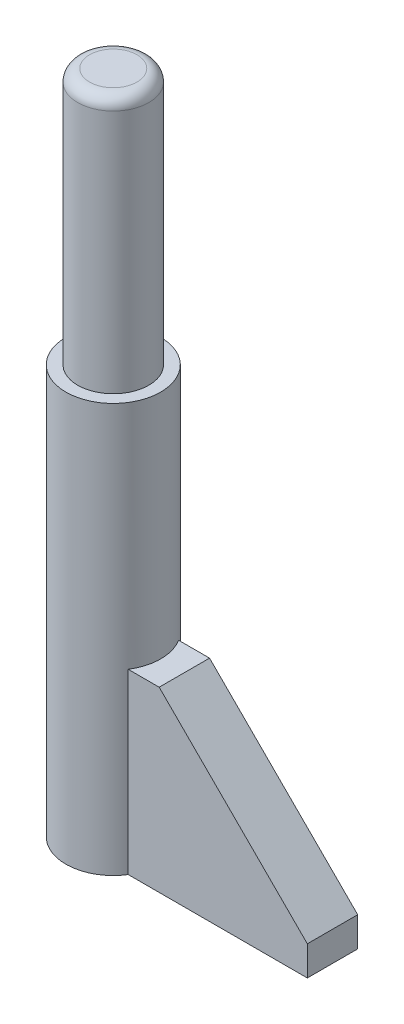
ISO-10303-21;
HEADER;
FILE_DESCRIPTION(('STEP AP214'),'2;1');
FILE_NAME('part.step','',(''),(''),'','','');
FILE_SCHEMA(('AUTOMOTIVE_DESIGN { 1 0 10303 214 1 1 1 1 }'));
ENDSEC;
DATA;
#1=APPLICATION_CONTEXT('core data for automotive mechanical design processes');
#2=APPLICATION_PROTOCOL_DEFINITION('international standard','automotive_design',2000,#1);
#3=PRODUCT_CONTEXT('',#1,'mechanical');
#4=PRODUCT('Part','Part','',(#3));
#5=PRODUCT_RELATED_PRODUCT_CATEGORY('part','',(#4));
#6=PRODUCT_DEFINITION_FORMATION('','',#4);
#7=PRODUCT_DEFINITION_CONTEXT('part definition',#1,'design');
#8=PRODUCT_DEFINITION('design','',#6,#7);
#9=PRODUCT_DEFINITION_SHAPE('','',#8);
#10=(LENGTH_UNIT() NAMED_UNIT(*) SI_UNIT(.MILLI.,.METRE.));
#11=(NAMED_UNIT(*) PLANE_ANGLE_UNIT() SI_UNIT($,.RADIAN.));
#12=(NAMED_UNIT(*) SI_UNIT($,.STERADIAN.) SOLID_ANGLE_UNIT());
#13=UNCERTAINTY_MEASURE_WITH_UNIT(LENGTH_MEASURE(1.E-05),#10,'distance_accuracy_value','');
#14=(GEOMETRIC_REPRESENTATION_CONTEXT(3) GLOBAL_UNCERTAINTY_ASSIGNED_CONTEXT((#13)) GLOBAL_UNIT_ASSIGNED_CONTEXT((#10,
#11,#12)) REPRESENTATION_CONTEXT('',''));
#15=CARTESIAN_POINT('',(0.,0.,0.));
#16=DIRECTION('',(0.,0.,1.));
#17=DIRECTION('',(1.,0.,0.));
#18=AXIS2_PLACEMENT_3D('',#15,#16,#17);
#19=CARTESIAN_POINT('',(0.,17.526,0.));
#20=DIRECTION('',(0.,-1.,0.));
#21=DIRECTION('',(0.,0.,-1.));
#22=AXIS2_PLACEMENT_3D('',#19,#20,#21);
#23=CYLINDRICAL_SURFACE('',#22,2.032);
#24=CARTESIAN_POINT('',(0.,0.,0.));
#25=DIRECTION('',(0.,1.,0.));
#26=DIRECTION('',(0.,0.,1.));
#27=AXIS2_PLACEMENT_3D('',#24,#25,#26);
#28=CIRCLE('',#27,2.032);
#29=CARTESIAN_POINT('',(1.7215410973892,0.,-1.0795));
#30=VERTEX_POINT('',#29);
#31=CARTESIAN_POINT('',(1.7215410973892,0.,1.0795));
#32=VERTEX_POINT('',#31);
#33=EDGE_CURVE('E101',#30,#32,#28,.T.);
#34=ORIENTED_EDGE('',*,*,#33,.T.);
#35=DIRECTION('',(0.,-1.,0.));
#36=VECTOR('',#35,1.);
#37=CARTESIAN_POINT('',(1.7215410973892,17.526,1.0795));
#38=LINE('',#37,#36);
#39=CARTESIAN_POINT('',(1.7215410973892,7.62,1.0795));
#40=VERTEX_POINT('',#39);
#41=EDGE_CURVE('E115',#32,#40,#38,.F.);
#42=ORIENTED_EDGE('',*,*,#41,.T.);
#43=CARTESIAN_POINT('',(0.,7.62,0.));
#44=DIRECTION('',(0.,-1.,0.));
#45=DIRECTION('',(0.,0.,-1.));
#46=AXIS2_PLACEMENT_3D('',#43,#44,#45);
#47=CIRCLE('',#46,2.032);
#48=CARTESIAN_POINT('',(1.7215410973892,7.62,-1.0795));
#49=VERTEX_POINT('',#48);
#50=EDGE_CURVE('E121',#49,#40,#47,.T.);
#51=ORIENTED_EDGE('',*,*,#50,.F.);
#52=DIRECTION('',(0.,-1.,0.));
#53=VECTOR('',#52,1.);
#54=CARTESIAN_POINT('',(1.7215410973892,17.526,-1.0795));
#55=LINE('',#54,#53);
#56=EDGE_CURVE('E112',#49,#30,#55,.T.);
#57=ORIENTED_EDGE('',*,*,#56,.T.);
#58=EDGE_LOOP('',(#34,#42,#51,#57));
#59=FACE_BOUND('',#58,.T.);
#60=CARTESIAN_POINT('',(0.,17.526,0.));
#61=DIRECTION('',(0.,1.,0.));
#62=DIRECTION('',(0.,0.,1.));
#63=AXIS2_PLACEMENT_3D('',#60,#61,#62);
#64=CIRCLE('',#63,2.032);
#65=CARTESIAN_POINT('',(0.,17.526,2.032));
#66=VERTEX_POINT('',#65);
#67=EDGE_CURVE('E118',#66,#66,#64,.T.);
#68=ORIENTED_EDGE('',*,*,#67,.F.);
#69=EDGE_LOOP('',(#68));
#70=FACE_BOUND('',#69,.T.);
#71=ADVANCED_FACE('F33',(#59,#70),#23,.T.);
#72=CARTESIAN_POINT('',(0.,17.526,0.));
#73=DIRECTION('',(0.,1.,0.));
#74=DIRECTION('',(0.,0.,1.));
#75=AXIS2_PLACEMENT_3D('',#72,#73,#74);
#76=PLANE('',#75);
#77=CARTESIAN_POINT('',(0.,17.526,0.));
#78=DIRECTION('',(0.,1.,0.));
#79=DIRECTION('',(0.,0.,1.));
#80=AXIS2_PLACEMENT_3D('',#77,#78,#79);
#81=CIRCLE('',#80,1.524);
#82=CARTESIAN_POINT('',(0.,17.526,1.524));
#83=VERTEX_POINT('',#82);
#84=EDGE_CURVE('E103',#83,#83,#81,.T.);
#85=ORIENTED_EDGE('',*,*,#84,.F.);
#86=EDGE_LOOP('',(#85));
#87=FACE_BOUND('',#86,.T.);
#88=ORIENTED_EDGE('',*,*,#67,.T.);
#89=EDGE_LOOP('',(#88));
#90=FACE_BOUND('',#89,.T.);
#91=ADVANCED_FACE('F143',(#87,#90),#76,.T.);
#92=CARTESIAN_POINT('',(0.,0.,0.));
#93=DIRECTION('',(0.,1.,0.));
#94=DIRECTION('',(0.,0.,1.));
#95=AXIS2_PLACEMENT_3D('',#92,#93,#94);
#96=PLANE('',#95);
#97=ORIENTED_EDGE('',*,*,#33,.F.);
#98=DIRECTION('',(1.,0.,0.));
#99=VECTOR('',#98,1.);
#100=CARTESIAN_POINT('',(9.398,0.,-1.0795));
#101=LINE('',#100,#99);
#102=CARTESIAN_POINT('',(9.398,0.,-1.0795));
#103=VERTEX_POINT('',#102);
#104=EDGE_CURVE('E85',#30,#103,#101,.T.);
#105=ORIENTED_EDGE('',*,*,#104,.T.);
#106=DIRECTION('',(0.,0.,1.));
#107=VECTOR('',#106,1.);
#108=CARTESIAN_POINT('',(9.398,0.,-1.0795));
#109=LINE('',#108,#107);
#110=CARTESIAN_POINT('',(9.398,0.,1.0795));
#111=VERTEX_POINT('',#110);
#112=EDGE_CURVE('E99',#103,#111,#109,.T.);
#113=ORIENTED_EDGE('',*,*,#112,.T.);
#114=DIRECTION('',(-1.,0.,0.));
#115=VECTOR('',#114,1.);
#116=CARTESIAN_POINT('',(9.398,0.,1.0795));
#117=LINE('',#116,#115);
#118=EDGE_CURVE('E106',#111,#32,#117,.T.);
#119=ORIENTED_EDGE('',*,*,#118,.T.);
#120=EDGE_LOOP('',(#97,#105,#113,#119));
#121=FACE_BOUND('',#120,.T.);
#122=ADVANCED_FACE('F97',(#121),#96,.F.);
#123=CARTESIAN_POINT('',(9.398,7.62,1.0795));
#124=DIRECTION('',(0.,0.,1.));
#125=DIRECTION('',(1.,0.,0.));
#126=AXIS2_PLACEMENT_3D('',#123,#124,#125);
#127=PLANE('',#126);
#128=DIRECTION('',(0.,-1.,0.));
#129=VECTOR('',#128,1.);
#130=CARTESIAN_POINT('',(9.398,7.62,1.0795));
#131=LINE('',#130,#129);
#132=CARTESIAN_POINT('',(9.398,1.27000000000001,1.0795));
#133=VERTEX_POINT('',#132);
#134=EDGE_CURVE('E92',#133,#111,#131,.T.);
#135=ORIENTED_EDGE('',*,*,#134,.F.);
#136=DIRECTION('',(-0.707106781186549,0.707106781186546,0.));
#137=VECTOR('',#136,1.);
#138=CARTESIAN_POINT('',(6.223,4.44499999999999,1.0795));
#139=LINE('',#138,#137);
#140=CARTESIAN_POINT('',(3.04799999999999,7.62,1.0795));
#141=VERTEX_POINT('',#140);
#142=EDGE_CURVE('E56',#133,#141,#139,.T.);
#143=ORIENTED_EDGE('',*,*,#142,.T.);
#144=DIRECTION('',(-1.,0.,0.));
#145=VECTOR('',#144,1.);
#146=CARTESIAN_POINT('',(9.398,7.62,1.0795));
#147=LINE('',#146,#145);
#148=EDGE_CURVE('E93',#141,#40,#147,.T.);
#149=ORIENTED_EDGE('',*,*,#148,.T.);
#150=ORIENTED_EDGE('',*,*,#41,.F.);
#151=ORIENTED_EDGE('',*,*,#118,.F.);
#152=EDGE_LOOP('',(#135,#143,#149,#150,#151));
#153=FACE_BOUND('',#152,.T.);
#154=ADVANCED_FACE('F164',(#153),#127,.T.);
#155=CARTESIAN_POINT('',(9.398,7.62,-1.0795));
#156=DIRECTION('',(0.,0.,-1.));
#157=DIRECTION('',(-1.,0.,0.));
#158=AXIS2_PLACEMENT_3D('',#155,#156,#157);
#159=PLANE('',#158);
#160=DIRECTION('',(1.,0.,0.));
#161=VECTOR('',#160,1.);
#162=CARTESIAN_POINT('',(9.398,7.62,-1.0795));
#163=LINE('',#162,#161);
#164=CARTESIAN_POINT('',(3.04799999999999,7.62,-1.0795));
#165=VERTEX_POINT('',#164);
#166=EDGE_CURVE('E108',#49,#165,#163,.T.);
#167=ORIENTED_EDGE('',*,*,#166,.T.);
#168=DIRECTION('',(0.707106781186549,-0.707106781186546,0.));
#169=VECTOR('',#168,1.);
#170=CARTESIAN_POINT('',(6.223,4.44499999999999,-1.0795));
#171=LINE('',#170,#169);
#172=CARTESIAN_POINT('',(9.398,1.27000000000001,-1.0795));
#173=VERTEX_POINT('',#172);
#174=EDGE_CURVE('E87',#165,#173,#171,.T.);
#175=ORIENTED_EDGE('',*,*,#174,.T.);
#176=DIRECTION('',(0.,-1.,0.));
#177=VECTOR('',#176,1.);
#178=CARTESIAN_POINT('',(9.398,7.62,-1.0795));
#179=LINE('',#178,#177);
#180=EDGE_CURVE('E81',#173,#103,#179,.T.);
#181=ORIENTED_EDGE('',*,*,#180,.T.);
#182=ORIENTED_EDGE('',*,*,#104,.F.);
#183=ORIENTED_EDGE('',*,*,#56,.F.);
#184=EDGE_LOOP('',(#167,#175,#181,#182,#183));
#185=FACE_BOUND('',#184,.T.);
#186=ADVANCED_FACE('F83',(#185),#159,.T.);
#187=CARTESIAN_POINT('',(9.398,7.62,-1.0795));
#188=DIRECTION('',(1.,0.,0.));
#189=DIRECTION('',(0.,0.,-1.));
#190=AXIS2_PLACEMENT_3D('',#187,#188,#189);
#191=PLANE('',#190);
#192=ORIENTED_EDGE('',*,*,#180,.F.);
#193=DIRECTION('',(0.,0.,1.));
#194=VECTOR('',#193,1.);
#195=CARTESIAN_POINT('',(9.398,1.27,1.0795));
#196=LINE('',#195,#194);
#197=EDGE_CURVE('E125',#173,#133,#196,.T.);
#198=ORIENTED_EDGE('',*,*,#197,.T.);
#199=ORIENTED_EDGE('',*,*,#134,.T.);
#200=ORIENTED_EDGE('',*,*,#112,.F.);
#201=EDGE_LOOP('',(#192,#198,#199,#200));
#202=FACE_BOUND('',#201,.T.);
#203=ADVANCED_FACE('F105',(#202),#191,.T.);
#204=CARTESIAN_POINT('',(0.,7.62,0.));
#205=DIRECTION('',(0.,-1.,0.));
#206=DIRECTION('',(0.,0.,-1.));
#207=AXIS2_PLACEMENT_3D('',#204,#205,#206);
#208=PLANE('',#207);
#209=ORIENTED_EDGE('',*,*,#148,.F.);
#210=DIRECTION('',(0.,0.,-1.));
#211=VECTOR('',#210,1.);
#212=CARTESIAN_POINT('',(3.04799999999999,7.62,-1.0795));
#213=LINE('',#212,#211);
#214=EDGE_CURVE('E48',#141,#165,#213,.T.);
#215=ORIENTED_EDGE('',*,*,#214,.T.);
#216=ORIENTED_EDGE('',*,*,#166,.F.);
#217=ORIENTED_EDGE('',*,*,#50,.T.);
#218=EDGE_LOOP('',(#209,#215,#216,#217));
#219=FACE_BOUND('',#218,.T.);
#220=ADVANCED_FACE('F155',(#219),#208,.F.);
#221=CARTESIAN_POINT('',(9.398,1.27,-1.0795));
#222=DIRECTION('',(0.707106781186546,0.707106781186549,0.));
#223=DIRECTION('',(0.,0.,-1.));
#224=AXIS2_PLACEMENT_3D('',#221,#222,#223);
#225=PLANE('',#224);
#226=ORIENTED_EDGE('',*,*,#174,.F.);
#227=ORIENTED_EDGE('',*,*,#214,.F.);
#228=ORIENTED_EDGE('',*,*,#142,.F.);
#229=ORIENTED_EDGE('',*,*,#197,.F.);
#230=EDGE_LOOP('',(#226,#227,#228,#229));
#231=FACE_BOUND('',#230,.T.);
#232=ADVANCED_FACE('F153',(#231),#225,.T.);
#233=CARTESIAN_POINT('',(0.,28.526,0.));
#234=DIRECTION('',(0.,-1.,0.));
#235=DIRECTION('',(0.,0.,-1.));
#236=AXIS2_PLACEMENT_3D('',#233,#234,#235);
#237=CYLINDRICAL_SURFACE('',#236,1.524);
#238=CARTESIAN_POINT('',(0.,28.018,0.));
#239=DIRECTION('',(0.,1.,0.));
#240=DIRECTION('',(0.,0.,1.));
#241=AXIS2_PLACEMENT_3D('',#238,#239,#240);
#242=CIRCLE('',#241,1.524);
#243=CARTESIAN_POINT('',(0.,28.018,1.524));
#244=VERTEX_POINT('',#243);
#245=EDGE_CURVE('E11',#244,#244,#242,.F.);
#246=ORIENTED_EDGE('',*,*,#245,.T.);
#247=EDGE_LOOP('',(#246));
#248=FACE_BOUND('',#247,.T.);
#249=ORIENTED_EDGE('',*,*,#84,.T.);
#250=EDGE_LOOP('',(#249));
#251=FACE_BOUND('',#250,.T.);
#252=ADVANCED_FACE('F139',(#248,#251),#237,.T.);
#253=CARTESIAN_POINT('',(0.,28.526,0.));
#254=DIRECTION('',(0.,1.,0.));
#255=DIRECTION('',(0.,0.,1.));
#256=AXIS2_PLACEMENT_3D('',#253,#254,#255);
#257=PLANE('',#256);
#258=CARTESIAN_POINT('',(0.,28.526,0.));
#259=DIRECTION('',(0.,1.,0.));
#260=DIRECTION('',(0.,0.,1.));
#261=AXIS2_PLACEMENT_3D('',#258,#259,#260);
#262=CIRCLE('',#261,1.016);
#263=CARTESIAN_POINT('',(0.,28.526,1.016));
#264=VERTEX_POINT('',#263);
#265=EDGE_CURVE('E41',#264,#264,#262,.T.);
#266=ORIENTED_EDGE('',*,*,#265,.T.);
#267=EDGE_LOOP('',(#266));
#268=FACE_BOUND('',#267,.T.);
#269=ADVANCED_FACE('F132',(#268),#257,.T.);
#270=CARTESIAN_POINT('',(0.,28.018,0.));
#271=DIRECTION('',(0.,1.,0.));
#272=DIRECTION('',(0.,0.,1.));
#273=AXIS2_PLACEMENT_3D('',#270,#271,#272);
#274=TOROIDAL_SURFACE('',#273,1.016,0.508);
#275=ORIENTED_EDGE('',*,*,#245,.F.);
#276=EDGE_LOOP('',(#275));
#277=FACE_BOUND('',#276,.T.);
#278=ORIENTED_EDGE('',*,*,#265,.F.);
#279=EDGE_LOOP('',(#278));
#280=FACE_BOUND('',#279,.T.);
#281=ADVANCED_FACE('F35',(#277,#280),#274,.T.);
#282=CLOSED_SHELL('',(#71,#91,#122,#154,#186,#203,#220,#232,#252,#269,#281));
#283=MANIFOLD_SOLID_BREP('B2',#282);
#284=ADVANCED_BREP_SHAPE_REPRESENTATION('',(#18,#283),#14);
#285=SHAPE_DEFINITION_REPRESENTATION(#9,#284);
ENDSEC;
END-ISO-10303-21;
